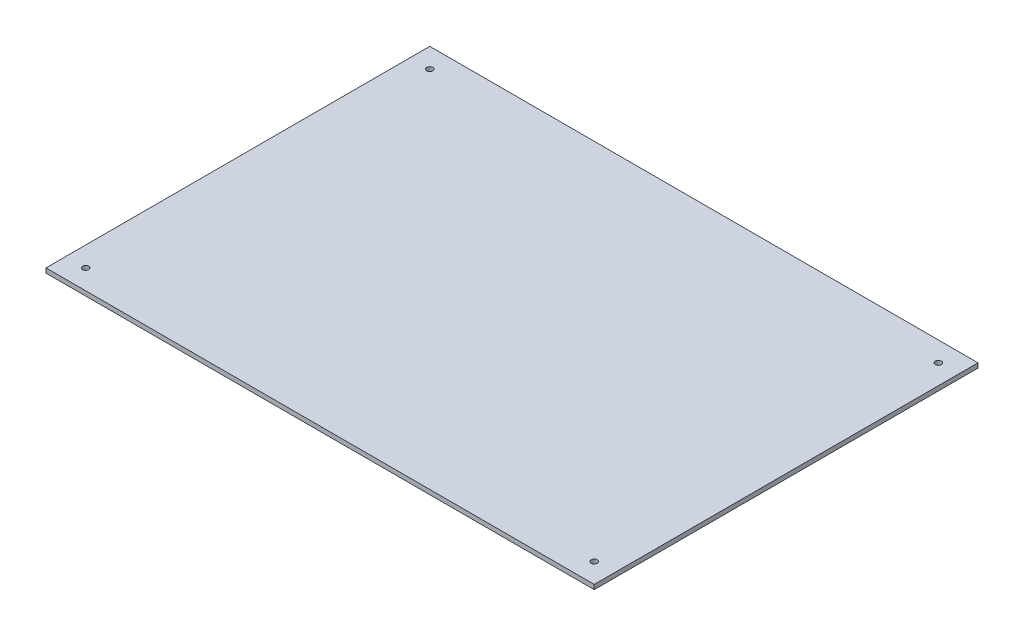
ISO-10303-21;
HEADER;
FILE_DESCRIPTION(('STEP AP214'),'2;1');
FILE_NAME('part.step','',(''),(''),'','','');
FILE_SCHEMA(('AUTOMOTIVE_DESIGN { 1 0 10303 214 1 1 1 1 }'));
ENDSEC;
DATA;
#1=APPLICATION_CONTEXT('core data for automotive mechanical design processes');
#2=APPLICATION_PROTOCOL_DEFINITION('international standard','automotive_design',2000,#1);
#3=PRODUCT_CONTEXT('',#1,'mechanical');
#4=PRODUCT('Part','Part','',(#3));
#5=PRODUCT_RELATED_PRODUCT_CATEGORY('part','',(#4));
#6=PRODUCT_DEFINITION_FORMATION('','',#4);
#7=PRODUCT_DEFINITION_CONTEXT('part definition',#1,'design');
#8=PRODUCT_DEFINITION('design','',#6,#7);
#9=PRODUCT_DEFINITION_SHAPE('','',#8);
#10=(LENGTH_UNIT() NAMED_UNIT(*) SI_UNIT(.MILLI.,.METRE.));
#11=(NAMED_UNIT(*) PLANE_ANGLE_UNIT() SI_UNIT($,.RADIAN.));
#12=(NAMED_UNIT(*) SI_UNIT($,.STERADIAN.) SOLID_ANGLE_UNIT());
#13=UNCERTAINTY_MEASURE_WITH_UNIT(LENGTH_MEASURE(1.E-05),#10,'distance_accuracy_value','');
#14=(GEOMETRIC_REPRESENTATION_CONTEXT(3) GLOBAL_UNCERTAINTY_ASSIGNED_CONTEXT((#13)) GLOBAL_UNIT_ASSIGNED_CONTEXT((#10,
#11,#12)) REPRESENTATION_CONTEXT('',''));
#15=CARTESIAN_POINT('',(0.,0.,0.));
#16=DIRECTION('',(0.,0.,1.));
#17=DIRECTION('',(1.,0.,0.));
#18=AXIS2_PLACEMENT_3D('',#15,#16,#17);
#19=CARTESIAN_POINT('',(0.,1.5,0.));
#20=DIRECTION('',(1.,0.,0.));
#21=DIRECTION('',(0.,0.,-1.));
#22=AXIS2_PLACEMENT_3D('',#19,#20,#21);
#23=PLANE('',#22);
#24=DIRECTION('',(0.,0.,1.));
#25=VECTOR('',#24,1.);
#26=CARTESIAN_POINT('',(0.,0.,0.));
#27=LINE('',#26,#25);
#28=CARTESIAN_POINT('',(0.,0.,0.));
#29=VERTEX_POINT('',#28);
#30=CARTESIAN_POINT('',(0.,0.,126.));
#31=VERTEX_POINT('',#30);
#32=EDGE_CURVE('E79',#29,#31,#27,.T.);
#33=ORIENTED_EDGE('',*,*,#32,.T.);
#34=DIRECTION('',(0.,-1.,0.));
#35=VECTOR('',#34,1.);
#36=CARTESIAN_POINT('',(0.,1.5,126.));
#37=LINE('',#36,#35);
#38=CARTESIAN_POINT('',(0.,1.5,126.));
#39=VERTEX_POINT('',#38);
#40=EDGE_CURVE('E11',#39,#31,#37,.T.);
#41=ORIENTED_EDGE('',*,*,#40,.F.);
#42=DIRECTION('',(0.,0.,1.));
#43=VECTOR('',#42,1.);
#44=CARTESIAN_POINT('',(0.,1.5,0.));
#45=LINE('',#44,#43);
#46=CARTESIAN_POINT('',(0.,1.5,0.));
#47=VERTEX_POINT('',#46);
#48=EDGE_CURVE('E67',#47,#39,#45,.T.);
#49=ORIENTED_EDGE('',*,*,#48,.F.);
#50=DIRECTION('',(0.,-1.,0.));
#51=VECTOR('',#50,1.);
#52=CARTESIAN_POINT('',(0.,1.5,0.));
#53=LINE('',#52,#51);
#54=EDGE_CURVE('E75',#47,#29,#53,.T.);
#55=ORIENTED_EDGE('',*,*,#54,.T.);
#56=EDGE_LOOP('',(#33,#41,#49,#55));
#57=FACE_BOUND('',#56,.T.);
#58=ADVANCED_FACE('F16',(#57),#23,.F.);
#59=CARTESIAN_POINT('',(0.,1.5,126.));
#60=DIRECTION('',(0.,0.,-1.));
#61=DIRECTION('',(-1.,0.,0.));
#62=AXIS2_PLACEMENT_3D('',#59,#60,#61);
#63=PLANE('',#62);
#64=DIRECTION('',(1.,0.,0.));
#65=VECTOR('',#64,1.);
#66=CARTESIAN_POINT('',(0.,0.,126.));
#67=LINE('',#66,#65);
#68=CARTESIAN_POINT('',(180.,0.,126.));
#69=VERTEX_POINT('',#68);
#70=EDGE_CURVE('E71',#31,#69,#67,.T.);
#71=ORIENTED_EDGE('',*,*,#70,.T.);
#72=DIRECTION('',(0.,-1.,0.));
#73=VECTOR('',#72,1.);
#74=CARTESIAN_POINT('',(180.,1.5,126.));
#75=LINE('',#74,#73);
#76=CARTESIAN_POINT('',(180.,1.5,126.));
#77=VERTEX_POINT('',#76);
#78=EDGE_CURVE('E24',#77,#69,#75,.T.);
#79=ORIENTED_EDGE('',*,*,#78,.F.);
#80=DIRECTION('',(1.,0.,0.));
#81=VECTOR('',#80,1.);
#82=CARTESIAN_POINT('',(0.,1.5,126.));
#83=LINE('',#82,#81);
#84=EDGE_CURVE('E62',#39,#77,#83,.T.);
#85=ORIENTED_EDGE('',*,*,#84,.F.);
#86=ORIENTED_EDGE('',*,*,#40,.T.);
#87=EDGE_LOOP('',(#71,#79,#85,#86));
#88=FACE_BOUND('',#87,.T.);
#89=ADVANCED_FACE('F70',(#88),#63,.F.);
#90=CARTESIAN_POINT('',(180.,1.5,0.));
#91=DIRECTION('',(-1.,0.,0.));
#92=DIRECTION('',(0.,0.,1.));
#93=AXIS2_PLACEMENT_3D('',#90,#91,#92);
#94=PLANE('',#93);
#95=DIRECTION('',(0.,0.,-1.));
#96=VECTOR('',#95,1.);
#97=CARTESIAN_POINT('',(180.,0.,0.));
#98=LINE('',#97,#96);
#99=CARTESIAN_POINT('',(180.,0.,0.));
#100=VERTEX_POINT('',#99);
#101=EDGE_CURVE('E49',#69,#100,#98,.T.);
#102=ORIENTED_EDGE('',*,*,#101,.T.);
#103=DIRECTION('',(0.,-1.,0.));
#104=VECTOR('',#103,1.);
#105=CARTESIAN_POINT('',(180.,1.5,0.));
#106=LINE('',#105,#104);
#107=CARTESIAN_POINT('',(180.,1.5,0.));
#108=VERTEX_POINT('',#107);
#109=EDGE_CURVE('E72',#108,#100,#106,.T.);
#110=ORIENTED_EDGE('',*,*,#109,.F.);
#111=DIRECTION('',(0.,0.,-1.));
#112=VECTOR('',#111,1.);
#113=CARTESIAN_POINT('',(180.,1.5,0.));
#114=LINE('',#113,#112);
#115=EDGE_CURVE('E65',#77,#108,#114,.T.);
#116=ORIENTED_EDGE('',*,*,#115,.F.);
#117=ORIENTED_EDGE('',*,*,#78,.T.);
#118=EDGE_LOOP('',(#102,#110,#116,#117));
#119=FACE_BOUND('',#118,.T.);
#120=ADVANCED_FACE('F73',(#119),#94,.F.);
#121=CARTESIAN_POINT('',(0.,1.5,0.));
#122=DIRECTION('',(0.,0.,1.));
#123=DIRECTION('',(1.,0.,0.));
#124=AXIS2_PLACEMENT_3D('',#121,#122,#123);
#125=PLANE('',#124);
#126=DIRECTION('',(-1.,0.,0.));
#127=VECTOR('',#126,1.);
#128=CARTESIAN_POINT('',(0.,0.,0.));
#129=LINE('',#128,#127);
#130=EDGE_CURVE('E55',#100,#29,#129,.T.);
#131=ORIENTED_EDGE('',*,*,#130,.T.);
#132=ORIENTED_EDGE('',*,*,#54,.F.);
#133=DIRECTION('',(-1.,0.,0.));
#134=VECTOR('',#133,1.);
#135=CARTESIAN_POINT('',(0.,1.5,0.));
#136=LINE('',#135,#134);
#137=EDGE_CURVE('E32',#108,#47,#136,.T.);
#138=ORIENTED_EDGE('',*,*,#137,.F.);
#139=ORIENTED_EDGE('',*,*,#109,.T.);
#140=EDGE_LOOP('',(#131,#132,#138,#139));
#141=FACE_BOUND('',#140,.T.);
#142=ADVANCED_FACE('F87',(#141),#125,.F.);
#143=CARTESIAN_POINT('',(0.,1.5,126.));
#144=DIRECTION('',(0.,1.,0.));
#145=DIRECTION('',(0.,0.,1.));
#146=AXIS2_PLACEMENT_3D('',#143,#144,#145);
#147=PLANE('',#146);
#148=CARTESIAN_POINT('',(173.5,1.5,119.5));
#149=DIRECTION('',(0.,-1.,0.));
#150=DIRECTION('',(0.,0.,-1.));
#151=AXIS2_PLACEMENT_3D('',#148,#149,#150);
#152=CIRCLE('',#151,1.);
#153=CARTESIAN_POINT('',(173.5,1.5,118.5));
#154=VERTEX_POINT('',#153);
#155=EDGE_CURVE('E108',#154,#154,#152,.T.);
#156=ORIENTED_EDGE('',*,*,#155,.T.);
#157=EDGE_LOOP('',(#156));
#158=FACE_BOUND('',#157,.T.);
#159=CARTESIAN_POINT('',(6.49999999999952,1.5,119.5));
#160=DIRECTION('',(0.,-1.,0.));
#161=DIRECTION('',(0.,0.,-1.));
#162=AXIS2_PLACEMENT_3D('',#159,#160,#161);
#163=CIRCLE('',#162,1.);
#164=CARTESIAN_POINT('',(6.49999999999952,1.5,118.5));
#165=VERTEX_POINT('',#164);
#166=EDGE_CURVE('E102',#165,#165,#163,.T.);
#167=ORIENTED_EDGE('',*,*,#166,.T.);
#168=EDGE_LOOP('',(#167));
#169=FACE_BOUND('',#168,.T.);
#170=CARTESIAN_POINT('',(6.49999999999948,1.5,6.5));
#171=DIRECTION('',(0.,-1.,0.));
#172=DIRECTION('',(0.,0.,-1.));
#173=AXIS2_PLACEMENT_3D('',#170,#171,#172);
#174=CIRCLE('',#173,1.);
#175=CARTESIAN_POINT('',(6.49999999999948,1.5,5.5));
#176=VERTEX_POINT('',#175);
#177=EDGE_CURVE('E96',#176,#176,#174,.T.);
#178=ORIENTED_EDGE('',*,*,#177,.T.);
#179=EDGE_LOOP('',(#178));
#180=FACE_BOUND('',#179,.T.);
#181=CARTESIAN_POINT('',(173.5,1.5,6.5));
#182=DIRECTION('',(0.,-1.,0.));
#183=DIRECTION('',(0.,0.,-1.));
#184=AXIS2_PLACEMENT_3D('',#181,#182,#183);
#185=CIRCLE('',#184,1.);
#186=CARTESIAN_POINT('',(173.5,1.5,5.5));
#187=VERTEX_POINT('',#186);
#188=EDGE_CURVE('E82',#187,#187,#185,.T.);
#189=ORIENTED_EDGE('',*,*,#188,.T.);
#190=EDGE_LOOP('',(#189));
#191=FACE_BOUND('',#190,.T.);
#192=ORIENTED_EDGE('',*,*,#48,.T.);
#193=ORIENTED_EDGE('',*,*,#84,.T.);
#194=ORIENTED_EDGE('',*,*,#115,.T.);
#195=ORIENTED_EDGE('',*,*,#137,.T.);
#196=EDGE_LOOP('',(#192,#193,#194,#195));
#197=FACE_BOUND('',#196,.T.);
#198=ADVANCED_FACE('F63',(#158,#169,#180,#191,#197),#147,.T.);
#199=CARTESIAN_POINT('',(0.,0.,126.));
#200=DIRECTION('',(0.,1.,0.));
#201=DIRECTION('',(0.,0.,1.));
#202=AXIS2_PLACEMENT_3D('',#199,#200,#201);
#203=PLANE('',#202);
#204=CARTESIAN_POINT('',(173.5,0.,119.5));
#205=DIRECTION('',(0.,-1.,0.));
#206=DIRECTION('',(0.,0.,-1.));
#207=AXIS2_PLACEMENT_3D('',#204,#205,#206);
#208=CIRCLE('',#207,1.);
#209=CARTESIAN_POINT('',(173.5,0.,118.5));
#210=VERTEX_POINT('',#209);
#211=EDGE_CURVE('E111',#210,#210,#208,.T.);
#212=ORIENTED_EDGE('',*,*,#211,.F.);
#213=EDGE_LOOP('',(#212));
#214=FACE_BOUND('',#213,.T.);
#215=CARTESIAN_POINT('',(6.49999999999952,0.,119.5));
#216=DIRECTION('',(0.,-1.,0.));
#217=DIRECTION('',(0.,0.,-1.));
#218=AXIS2_PLACEMENT_3D('',#215,#216,#217);
#219=CIRCLE('',#218,1.);
#220=CARTESIAN_POINT('',(6.49999999999952,0.,118.5));
#221=VERTEX_POINT('',#220);
#222=EDGE_CURVE('E105',#221,#221,#219,.T.);
#223=ORIENTED_EDGE('',*,*,#222,.F.);
#224=EDGE_LOOP('',(#223));
#225=FACE_BOUND('',#224,.T.);
#226=CARTESIAN_POINT('',(6.49999999999948,0.,6.5));
#227=DIRECTION('',(0.,-1.,0.));
#228=DIRECTION('',(0.,0.,-1.));
#229=AXIS2_PLACEMENT_3D('',#226,#227,#228);
#230=CIRCLE('',#229,1.);
#231=CARTESIAN_POINT('',(6.49999999999948,0.,5.5));
#232=VERTEX_POINT('',#231);
#233=EDGE_CURVE('E99',#232,#232,#230,.T.);
#234=ORIENTED_EDGE('',*,*,#233,.F.);
#235=EDGE_LOOP('',(#234));
#236=FACE_BOUND('',#235,.T.);
#237=CARTESIAN_POINT('',(173.5,0.,6.5));
#238=DIRECTION('',(0.,-1.,0.));
#239=DIRECTION('',(0.,0.,-1.));
#240=AXIS2_PLACEMENT_3D('',#237,#238,#239);
#241=CIRCLE('',#240,1.);
#242=CARTESIAN_POINT('',(173.5,0.,5.5));
#243=VERTEX_POINT('',#242);
#244=EDGE_CURVE('E93',#243,#243,#241,.T.);
#245=ORIENTED_EDGE('',*,*,#244,.F.);
#246=EDGE_LOOP('',(#245));
#247=FACE_BOUND('',#246,.T.);
#248=ORIENTED_EDGE('',*,*,#32,.F.);
#249=ORIENTED_EDGE('',*,*,#130,.F.);
#250=ORIENTED_EDGE('',*,*,#101,.F.);
#251=ORIENTED_EDGE('',*,*,#70,.F.);
#252=EDGE_LOOP('',(#248,#249,#250,#251));
#253=FACE_BOUND('',#252,.T.);
#254=ADVANCED_FACE('F90',(#214,#225,#236,#247,#253),#203,.F.);
#255=CARTESIAN_POINT('',(173.5,1.5,6.5));
#256=DIRECTION('',(0.,-1.,0.));
#257=DIRECTION('',(0.,0.,-1.));
#258=AXIS2_PLACEMENT_3D('',#255,#256,#257);
#259=CYLINDRICAL_SURFACE('',#258,1.);
#260=ORIENTED_EDGE('',*,*,#188,.F.);
#261=EDGE_LOOP('',(#260));
#262=FACE_BOUND('',#261,.T.);
#263=ORIENTED_EDGE('',*,*,#244,.T.);
#264=EDGE_LOOP('',(#263));
#265=FACE_BOUND('',#264,.T.);
#266=ADVANCED_FACE('F128',(#262,#265),#259,.F.);
#267=CARTESIAN_POINT('',(6.49999999999948,1.5,6.5));
#268=DIRECTION('',(0.,-1.,0.));
#269=DIRECTION('',(0.,0.,-1.));
#270=AXIS2_PLACEMENT_3D('',#267,#268,#269);
#271=CYLINDRICAL_SURFACE('',#270,1.);
#272=ORIENTED_EDGE('',*,*,#177,.F.);
#273=EDGE_LOOP('',(#272));
#274=FACE_BOUND('',#273,.T.);
#275=ORIENTED_EDGE('',*,*,#233,.T.);
#276=EDGE_LOOP('',(#275));
#277=FACE_BOUND('',#276,.T.);
#278=ADVANCED_FACE('F137',(#274,#277),#271,.F.);
#279=CARTESIAN_POINT('',(6.49999999999952,1.5,119.5));
#280=DIRECTION('',(0.,-1.,0.));
#281=DIRECTION('',(0.,0.,-1.));
#282=AXIS2_PLACEMENT_3D('',#279,#280,#281);
#283=CYLINDRICAL_SURFACE('',#282,1.);
#284=ORIENTED_EDGE('',*,*,#166,.F.);
#285=EDGE_LOOP('',(#284));
#286=FACE_BOUND('',#285,.T.);
#287=ORIENTED_EDGE('',*,*,#222,.T.);
#288=EDGE_LOOP('',(#287));
#289=FACE_BOUND('',#288,.T.);
#290=ADVANCED_FACE('F122',(#286,#289),#283,.F.);
#291=CARTESIAN_POINT('',(173.5,1.5,119.5));
#292=DIRECTION('',(0.,-1.,0.));
#293=DIRECTION('',(0.,0.,-1.));
#294=AXIS2_PLACEMENT_3D('',#291,#292,#293);
#295=CYLINDRICAL_SURFACE('',#294,1.);
#296=ORIENTED_EDGE('',*,*,#155,.F.);
#297=EDGE_LOOP('',(#296));
#298=FACE_BOUND('',#297,.T.);
#299=ORIENTED_EDGE('',*,*,#211,.T.);
#300=EDGE_LOOP('',(#299));
#301=FACE_BOUND('',#300,.T.);
#302=ADVANCED_FACE('F119',(#298,#301),#295,.F.);
#303=CLOSED_SHELL('',(#58,#89,#120,#142,#198,#254,#266,#278,#290,#302));
#304=MANIFOLD_SOLID_BREP('B1',#303);
#305=ADVANCED_BREP_SHAPE_REPRESENTATION('',(#18,#304),#14);
#306=SHAPE_DEFINITION_REPRESENTATION(#9,#305);
ENDSEC;
END-ISO-10303-21;
